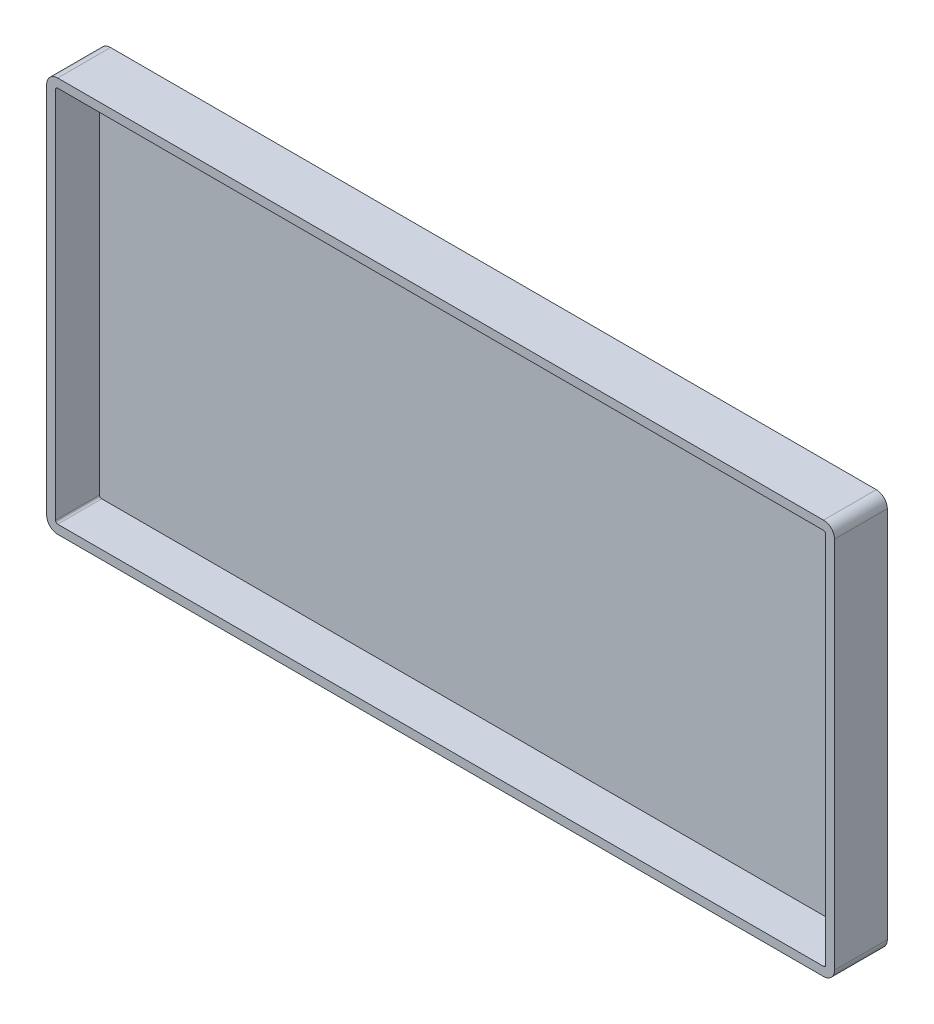
ISO-10303-21;
HEADER;
FILE_DESCRIPTION(('STEP AP214'),'2;1');
FILE_NAME('part.step','',(''),(''),'','','');
FILE_SCHEMA(('AUTOMOTIVE_DESIGN { 1 0 10303 214 1 1 1 1 }'));
ENDSEC;
DATA;
#1=APPLICATION_CONTEXT('core data for automotive mechanical design processes');
#2=APPLICATION_PROTOCOL_DEFINITION('international standard','automotive_design',2000,#1);
#3=PRODUCT_CONTEXT('',#1,'mechanical');
#4=PRODUCT('Part','Part','',(#3));
#5=PRODUCT_RELATED_PRODUCT_CATEGORY('part','',(#4));
#6=PRODUCT_DEFINITION_FORMATION('','',#4);
#7=PRODUCT_DEFINITION_CONTEXT('part definition',#1,'design');
#8=PRODUCT_DEFINITION('design','',#6,#7);
#9=PRODUCT_DEFINITION_SHAPE('','',#8);
#10=(LENGTH_UNIT() NAMED_UNIT(*) SI_UNIT(.MILLI.,.METRE.));
#11=(NAMED_UNIT(*) PLANE_ANGLE_UNIT() SI_UNIT($,.RADIAN.));
#12=(NAMED_UNIT(*) SI_UNIT($,.STERADIAN.) SOLID_ANGLE_UNIT());
#13=UNCERTAINTY_MEASURE_WITH_UNIT(LENGTH_MEASURE(1.E-05),#10,'distance_accuracy_value','');
#14=(GEOMETRIC_REPRESENTATION_CONTEXT(3) GLOBAL_UNCERTAINTY_ASSIGNED_CONTEXT((#13)) GLOBAL_UNIT_ASSIGNED_CONTEXT((#10,
#11,#12)) REPRESENTATION_CONTEXT('',''));
#15=CARTESIAN_POINT('',(0.,0.,0.));
#16=DIRECTION('',(0.,0.,1.));
#17=DIRECTION('',(1.,0.,0.));
#18=AXIS2_PLACEMENT_3D('',#15,#16,#17);
#19=CARTESIAN_POINT('',(87.5,42.4,10.));
#20=DIRECTION('',(0.,0.,-1.));
#21=DIRECTION('',(0.,-1.,0.));
#22=AXIS2_PLACEMENT_3D('',#19,#20,#21);
#23=PLANE('',#22);
#24=DIRECTION('',(0.,-1.,0.));
#25=VECTOR('',#24,1.);
#26=CARTESIAN_POINT('',(87.5,42.4,10.));
#27=LINE('',#26,#25);
#28=CARTESIAN_POINT('',(87.5,42.4,10.));
#29=VERTEX_POINT('',#28);
#30=CARTESIAN_POINT('',(87.5,-42.4,10.));
#31=VERTEX_POINT('',#30);
#32=EDGE_CURVE('E212',#29,#31,#27,.T.);
#33=ORIENTED_EDGE('',*,*,#32,.T.);
#34=CARTESIAN_POINT('',(87.,-42.4,10.));
#35=DIRECTION('',(0.,0.,1.));
#36=DIRECTION('',(1.,0.,0.));
#37=AXIS2_PLACEMENT_3D('',#34,#35,#36);
#38=CIRCLE('',#37,0.500000000000014);
#39=CARTESIAN_POINT('',(87.,-42.9,10.));
#40=VERTEX_POINT('',#39);
#41=EDGE_CURVE('E217',#40,#31,#38,.T.);
#42=ORIENTED_EDGE('',*,*,#41,.F.);
#43=DIRECTION('',(1.,0.,0.));
#44=VECTOR('',#43,1.);
#45=CARTESIAN_POINT('',(-87.,-42.9,10.));
#46=LINE('',#45,#44);
#47=CARTESIAN_POINT('',(-87.,-42.9,10.));
#48=VERTEX_POINT('',#47);
#49=EDGE_CURVE('E227',#48,#40,#46,.T.);
#50=ORIENTED_EDGE('',*,*,#49,.F.);
#51=CARTESIAN_POINT('',(-87.,-42.4,10.));
#52=DIRECTION('',(0.,0.,1.));
#53=DIRECTION('',(1.,0.,0.));
#54=AXIS2_PLACEMENT_3D('',#51,#52,#53);
#55=CIRCLE('',#54,0.500000000000007);
#56=CARTESIAN_POINT('',(-87.5,-42.4,10.));
#57=VERTEX_POINT('',#56);
#58=EDGE_CURVE('E232',#57,#48,#55,.T.);
#59=ORIENTED_EDGE('',*,*,#58,.F.);
#60=DIRECTION('',(0.,-1.,0.));
#61=VECTOR('',#60,1.);
#62=CARTESIAN_POINT('',(-87.5,42.4,10.));
#63=LINE('',#62,#61);
#64=CARTESIAN_POINT('',(-87.5,42.4,10.));
#65=VERTEX_POINT('',#64);
#66=EDGE_CURVE('E237',#65,#57,#63,.T.);
#67=ORIENTED_EDGE('',*,*,#66,.F.);
#68=CARTESIAN_POINT('',(-87.,42.4,10.));
#69=DIRECTION('',(0.,0.,1.));
#70=DIRECTION('',(1.,0.,0.));
#71=AXIS2_PLACEMENT_3D('',#68,#69,#70);
#72=CIRCLE('',#71,0.5);
#73=CARTESIAN_POINT('',(-87.,42.9,10.));
#74=VERTEX_POINT('',#73);
#75=EDGE_CURVE('E46',#74,#65,#72,.T.);
#76=ORIENTED_EDGE('',*,*,#75,.F.);
#77=DIRECTION('',(1.,0.,0.));
#78=VECTOR('',#77,1.);
#79=CARTESIAN_POINT('',(-87.,42.9,10.));
#80=LINE('',#79,#78);
#81=CARTESIAN_POINT('',(87.,42.9,10.));
#82=VERTEX_POINT('',#81);
#83=EDGE_CURVE('E193',#74,#82,#80,.T.);
#84=ORIENTED_EDGE('',*,*,#83,.T.);
#85=CARTESIAN_POINT('',(87.,42.4,10.));
#86=DIRECTION('',(0.,0.,-1.));
#87=DIRECTION('',(-1.,0.,0.));
#88=AXIS2_PLACEMENT_3D('',#85,#86,#87);
#89=CIRCLE('',#88,0.5);
#90=EDGE_CURVE('E208',#82,#29,#89,.T.);
#91=ORIENTED_EDGE('',*,*,#90,.T.);
#92=EDGE_LOOP('',(#33,#42,#50,#59,#67,#76,#84,#91));
#93=FACE_BOUND('',#92,.T.);
#94=DIRECTION('',(0.,-1.,0.));
#95=VECTOR('',#94,1.);
#96=CARTESIAN_POINT('',(89.5,42.4,10.));
#97=LINE('',#96,#95);
#98=CARTESIAN_POINT('',(89.5,42.4,10.));
#99=VERTEX_POINT('',#98);
#100=CARTESIAN_POINT('',(89.5,-42.4,10.));
#101=VERTEX_POINT('',#100);
#102=EDGE_CURVE('E40',#99,#101,#97,.T.);
#103=ORIENTED_EDGE('',*,*,#102,.F.);
#104=CARTESIAN_POINT('',(87.,42.4,10.));
#105=DIRECTION('',(0.,0.,1.));
#106=DIRECTION('',(1.,0.,0.));
#107=AXIS2_PLACEMENT_3D('',#104,#105,#106);
#108=CIRCLE('',#107,2.5);
#109=CARTESIAN_POINT('',(87.,44.9,10.));
#110=VERTEX_POINT('',#109);
#111=EDGE_CURVE('E180',#110,#99,#108,.F.);
#112=ORIENTED_EDGE('',*,*,#111,.F.);
#113=DIRECTION('',(1.,0.,0.));
#114=VECTOR('',#113,1.);
#115=CARTESIAN_POINT('',(-87.,44.9,10.));
#116=LINE('',#115,#114);
#117=CARTESIAN_POINT('',(-87.,44.9,10.));
#118=VERTEX_POINT('',#117);
#119=EDGE_CURVE('E177',#118,#110,#116,.T.);
#120=ORIENTED_EDGE('',*,*,#119,.F.);
#121=CARTESIAN_POINT('',(-87.,42.4,10.));
#122=DIRECTION('',(0.,0.,1.));
#123=DIRECTION('',(1.,0.,0.));
#124=AXIS2_PLACEMENT_3D('',#121,#122,#123);
#125=CIRCLE('',#124,2.5);
#126=CARTESIAN_POINT('',(-89.5,42.4,10.));
#127=VERTEX_POINT('',#126);
#128=EDGE_CURVE('E172',#118,#127,#125,.T.);
#129=ORIENTED_EDGE('',*,*,#128,.T.);
#130=DIRECTION('',(0.,1.,0.));
#131=VECTOR('',#130,1.);
#132=CARTESIAN_POINT('',(-89.5,42.4,10.));
#133=LINE('',#132,#131);
#134=CARTESIAN_POINT('',(-89.5,-42.4,10.));
#135=VERTEX_POINT('',#134);
#136=EDGE_CURVE('E167',#127,#135,#133,.F.);
#137=ORIENTED_EDGE('',*,*,#136,.T.);
#138=CARTESIAN_POINT('',(-87.,-42.4,10.));
#139=DIRECTION('',(0.,0.,1.));
#140=DIRECTION('',(1.,0.,0.));
#141=AXIS2_PLACEMENT_3D('',#138,#139,#140);
#142=CIRCLE('',#141,2.50000000000001);
#143=CARTESIAN_POINT('',(-87.,-44.9,10.));
#144=VERTEX_POINT('',#143);
#145=EDGE_CURVE('E163',#135,#144,#142,.T.);
#146=ORIENTED_EDGE('',*,*,#145,.T.);
#147=DIRECTION('',(1.,0.,0.));
#148=VECTOR('',#147,1.);
#149=CARTESIAN_POINT('',(-87.,-44.9,10.));
#150=LINE('',#149,#148);
#151=CARTESIAN_POINT('',(87.,-44.9,10.));
#152=VERTEX_POINT('',#151);
#153=EDGE_CURVE('E154',#144,#152,#150,.T.);
#154=ORIENTED_EDGE('',*,*,#153,.T.);
#155=CARTESIAN_POINT('',(87.,-42.4,10.));
#156=DIRECTION('',(0.,0.,1.));
#157=DIRECTION('',(1.,0.,0.));
#158=AXIS2_PLACEMENT_3D('',#155,#156,#157);
#159=CIRCLE('',#158,2.50000000000001);
#160=EDGE_CURVE('E142',#152,#101,#159,.T.);
#161=ORIENTED_EDGE('',*,*,#160,.T.);
#162=EDGE_LOOP('',(#103,#112,#120,#129,#137,#146,#154,#161));
#163=FACE_BOUND('',#162,.T.);
#164=ADVANCED_FACE('F37',(#93,#163),#23,.F.);
#165=CARTESIAN_POINT('',(87.,-42.4,0.));
#166=DIRECTION('',(0.,0.,1.));
#167=DIRECTION('',(1.,0.,0.));
#168=AXIS2_PLACEMENT_3D('',#165,#166,#167);
#169=CYLINDRICAL_SURFACE('',#168,0.500000000000014);
#170=ORIENTED_EDGE('',*,*,#41,.T.);
#171=DIRECTION('',(0.,0.,1.));
#172=VECTOR('',#171,1.);
#173=CARTESIAN_POINT('',(87.5,-42.4,0.));
#174=LINE('',#173,#172);
#175=CARTESIAN_POINT('',(87.5,-42.4,0.));
#176=VERTEX_POINT('',#175);
#177=EDGE_CURVE('E214',#176,#31,#174,.T.);
#178=ORIENTED_EDGE('',*,*,#177,.F.);
#179=CARTESIAN_POINT('',(87.,-42.4,0.));
#180=DIRECTION('',(0.,0.,1.));
#181=DIRECTION('',(1.,0.,0.));
#182=AXIS2_PLACEMENT_3D('',#179,#180,#181);
#183=CIRCLE('',#182,0.500000000000014);
#184=CARTESIAN_POINT('',(87.,-42.9,0.));
#185=VERTEX_POINT('',#184);
#186=EDGE_CURVE('E222',#185,#176,#183,.T.);
#187=ORIENTED_EDGE('',*,*,#186,.F.);
#188=DIRECTION('',(0.,0.,1.));
#189=VECTOR('',#188,1.);
#190=CARTESIAN_POINT('',(87.,-42.9,0.));
#191=LINE('',#190,#189);
#192=EDGE_CURVE('E219',#185,#40,#191,.T.);
#193=ORIENTED_EDGE('',*,*,#192,.T.);
#194=EDGE_LOOP('',(#170,#178,#187,#193));
#195=FACE_BOUND('',#194,.T.);
#196=ADVANCED_FACE('F294',(#195),#169,.F.);
#197=CARTESIAN_POINT('',(-87.,-42.9,0.));
#198=DIRECTION('',(0.,-1.,0.));
#199=DIRECTION('',(0.,0.,-1.));
#200=AXIS2_PLACEMENT_3D('',#197,#198,#199);
#201=PLANE('',#200);
#202=ORIENTED_EDGE('',*,*,#49,.T.);
#203=ORIENTED_EDGE('',*,*,#192,.F.);
#204=DIRECTION('',(1.,0.,0.));
#205=VECTOR('',#204,1.);
#206=CARTESIAN_POINT('',(-87.,-42.9,0.));
#207=LINE('',#206,#205);
#208=CARTESIAN_POINT('',(-87.,-42.9,0.));
#209=VERTEX_POINT('',#208);
#210=EDGE_CURVE('E226',#209,#185,#207,.T.);
#211=ORIENTED_EDGE('',*,*,#210,.F.);
#212=DIRECTION('',(0.,0.,1.));
#213=VECTOR('',#212,1.);
#214=CARTESIAN_POINT('',(-87.,-42.9,0.));
#215=LINE('',#214,#213);
#216=EDGE_CURVE('E223',#209,#48,#215,.T.);
#217=ORIENTED_EDGE('',*,*,#216,.T.);
#218=EDGE_LOOP('',(#202,#203,#211,#217));
#219=FACE_BOUND('',#218,.T.);
#220=ADVANCED_FACE('F286',(#219),#201,.F.);
#221=CARTESIAN_POINT('',(-87.,-42.4,0.));
#222=DIRECTION('',(0.,0.,1.));
#223=DIRECTION('',(1.,0.,0.));
#224=AXIS2_PLACEMENT_3D('',#221,#222,#223);
#225=CYLINDRICAL_SURFACE('',#224,0.500000000000007);
#226=ORIENTED_EDGE('',*,*,#58,.T.);
#227=ORIENTED_EDGE('',*,*,#216,.F.);
#228=CARTESIAN_POINT('',(-87.,-42.4,0.));
#229=DIRECTION('',(0.,0.,1.));
#230=DIRECTION('',(1.,0.,0.));
#231=AXIS2_PLACEMENT_3D('',#228,#229,#230);
#232=CIRCLE('',#231,0.500000000000007);
#233=CARTESIAN_POINT('',(-87.5,-42.4,0.));
#234=VERTEX_POINT('',#233);
#235=EDGE_CURVE('E231',#234,#209,#232,.T.);
#236=ORIENTED_EDGE('',*,*,#235,.F.);
#237=DIRECTION('',(0.,0.,1.));
#238=VECTOR('',#237,1.);
#239=CARTESIAN_POINT('',(-87.5,-42.4,0.));
#240=LINE('',#239,#238);
#241=EDGE_CURVE('E228',#234,#57,#240,.T.);
#242=ORIENTED_EDGE('',*,*,#241,.T.);
#243=EDGE_LOOP('',(#226,#227,#236,#242));
#244=FACE_BOUND('',#243,.T.);
#245=ADVANCED_FACE('F287',(#244),#225,.F.);
#246=CARTESIAN_POINT('',(-87.5,42.4,0.));
#247=DIRECTION('',(-1.,0.,0.));
#248=DIRECTION('',(0.,0.,1.));
#249=AXIS2_PLACEMENT_3D('',#246,#247,#248);
#250=PLANE('',#249);
#251=ORIENTED_EDGE('',*,*,#66,.T.);
#252=ORIENTED_EDGE('',*,*,#241,.F.);
#253=DIRECTION('',(0.,-1.,0.));
#254=VECTOR('',#253,1.);
#255=CARTESIAN_POINT('',(-87.5,42.4,0.));
#256=LINE('',#255,#254);
#257=CARTESIAN_POINT('',(-87.5,42.4,0.));
#258=VERTEX_POINT('',#257);
#259=EDGE_CURVE('E236',#258,#234,#256,.T.);
#260=ORIENTED_EDGE('',*,*,#259,.F.);
#261=DIRECTION('',(0.,0.,1.));
#262=VECTOR('',#261,1.);
#263=CARTESIAN_POINT('',(-87.5,42.4,0.));
#264=LINE('',#263,#262);
#265=EDGE_CURVE('E233',#258,#65,#264,.T.);
#266=ORIENTED_EDGE('',*,*,#265,.T.);
#267=EDGE_LOOP('',(#251,#252,#260,#266));
#268=FACE_BOUND('',#267,.T.);
#269=ADVANCED_FACE('F305',(#268),#250,.F.);
#270=CARTESIAN_POINT('',(-87.,42.4,0.));
#271=DIRECTION('',(0.,0.,1.));
#272=DIRECTION('',(1.,0.,0.));
#273=AXIS2_PLACEMENT_3D('',#270,#271,#272);
#274=CYLINDRICAL_SURFACE('',#273,0.5);
#275=ORIENTED_EDGE('',*,*,#75,.T.);
#276=ORIENTED_EDGE('',*,*,#265,.F.);
#277=CARTESIAN_POINT('',(-87.,42.4,0.));
#278=DIRECTION('',(0.,0.,1.));
#279=DIRECTION('',(1.,0.,0.));
#280=AXIS2_PLACEMENT_3D('',#277,#278,#279);
#281=CIRCLE('',#280,0.5);
#282=CARTESIAN_POINT('',(-87.,42.9,0.));
#283=VERTEX_POINT('',#282);
#284=EDGE_CURVE('E11',#283,#258,#281,.T.);
#285=ORIENTED_EDGE('',*,*,#284,.F.);
#286=DIRECTION('',(0.,0.,1.));
#287=VECTOR('',#286,1.);
#288=CARTESIAN_POINT('',(-87.,42.9,0.));
#289=LINE('',#288,#287);
#290=EDGE_CURVE('E201',#283,#74,#289,.T.);
#291=ORIENTED_EDGE('',*,*,#290,.T.);
#292=EDGE_LOOP('',(#275,#276,#285,#291));
#293=FACE_BOUND('',#292,.T.);
#294=ADVANCED_FACE('F303',(#293),#274,.F.);
#295=CARTESIAN_POINT('',(87.5,42.4,0.));
#296=DIRECTION('',(-1.,0.,0.));
#297=DIRECTION('',(0.,-1.,0.));
#298=AXIS2_PLACEMENT_3D('',#295,#296,#297);
#299=PLANE('',#298);
#300=ORIENTED_EDGE('',*,*,#32,.F.);
#301=DIRECTION('',(0.,0.,1.));
#302=VECTOR('',#301,1.);
#303=CARTESIAN_POINT('',(87.5,42.4,0.));
#304=LINE('',#303,#302);
#305=CARTESIAN_POINT('',(87.5,42.4,0.));
#306=VERTEX_POINT('',#305);
#307=EDGE_CURVE('E209',#306,#29,#304,.T.);
#308=ORIENTED_EDGE('',*,*,#307,.F.);
#309=DIRECTION('',(0.,-1.,0.));
#310=VECTOR('',#309,1.);
#311=CARTESIAN_POINT('',(87.5,42.4,0.));
#312=LINE('',#311,#310);
#313=EDGE_CURVE('E218',#306,#176,#312,.T.);
#314=ORIENTED_EDGE('',*,*,#313,.T.);
#315=ORIENTED_EDGE('',*,*,#177,.T.);
#316=EDGE_LOOP('',(#300,#308,#314,#315));
#317=FACE_BOUND('',#316,.T.);
#318=ADVANCED_FACE('F297',(#317),#299,.T.);
#319=CARTESIAN_POINT('',(87.,42.4,0.));
#320=DIRECTION('',(0.,0.,1.));
#321=DIRECTION('',(1.,0.,0.));
#322=AXIS2_PLACEMENT_3D('',#319,#320,#321);
#323=CYLINDRICAL_SURFACE('',#322,0.5);
#324=ORIENTED_EDGE('',*,*,#90,.F.);
#325=DIRECTION('',(0.,0.,1.));
#326=VECTOR('',#325,1.);
#327=CARTESIAN_POINT('',(87.,42.9,0.));
#328=LINE('',#327,#326);
#329=CARTESIAN_POINT('',(87.,42.9,0.));
#330=VERTEX_POINT('',#329);
#331=EDGE_CURVE('E205',#330,#82,#328,.T.);
#332=ORIENTED_EDGE('',*,*,#331,.F.);
#333=CARTESIAN_POINT('',(87.,42.4,0.));
#334=DIRECTION('',(0.,0.,-1.));
#335=DIRECTION('',(-1.,0.,0.));
#336=AXIS2_PLACEMENT_3D('',#333,#334,#335);
#337=CIRCLE('',#336,0.5);
#338=EDGE_CURVE('E213',#330,#306,#337,.T.);
#339=ORIENTED_EDGE('',*,*,#338,.T.);
#340=ORIENTED_EDGE('',*,*,#307,.T.);
#341=EDGE_LOOP('',(#324,#332,#339,#340));
#342=FACE_BOUND('',#341,.T.);
#343=ADVANCED_FACE('F299',(#342),#323,.F.);
#344=CARTESIAN_POINT('',(-87.,42.9,0.));
#345=DIRECTION('',(0.,-1.,0.));
#346=DIRECTION('',(0.,0.,-1.));
#347=AXIS2_PLACEMENT_3D('',#344,#345,#346);
#348=PLANE('',#347);
#349=ORIENTED_EDGE('',*,*,#83,.F.);
#350=ORIENTED_EDGE('',*,*,#290,.F.);
#351=DIRECTION('',(1.,0.,0.));
#352=VECTOR('',#351,1.);
#353=CARTESIAN_POINT('',(-87.,42.9,0.));
#354=LINE('',#353,#352);
#355=EDGE_CURVE('E204',#283,#330,#354,.T.);
#356=ORIENTED_EDGE('',*,*,#355,.T.);
#357=ORIENTED_EDGE('',*,*,#331,.T.);
#358=EDGE_LOOP('',(#349,#350,#356,#357));
#359=FACE_BOUND('',#358,.T.);
#360=ADVANCED_FACE('F265',(#359),#348,.T.);
#361=CARTESIAN_POINT('',(87.,-42.4,0.));
#362=DIRECTION('',(0.,0.,1.));
#363=DIRECTION('',(1.,0.,0.));
#364=AXIS2_PLACEMENT_3D('',#361,#362,#363);
#365=PLANE('',#364);
#366=ORIENTED_EDGE('',*,*,#186,.T.);
#367=ORIENTED_EDGE('',*,*,#313,.F.);
#368=ORIENTED_EDGE('',*,*,#338,.F.);
#369=ORIENTED_EDGE('',*,*,#355,.F.);
#370=ORIENTED_EDGE('',*,*,#284,.T.);
#371=ORIENTED_EDGE('',*,*,#259,.T.);
#372=ORIENTED_EDGE('',*,*,#235,.T.);
#373=ORIENTED_EDGE('',*,*,#210,.T.);
#374=EDGE_LOOP('',(#366,#367,#368,#369,#370,#371,#372,#373));
#375=FACE_BOUND('',#374,.T.);
#376=ADVANCED_FACE('F270',(#375),#365,.T.);
#377=CARTESIAN_POINT('',(87.,-42.4,0.));
#378=DIRECTION('',(0.,0.,1.));
#379=DIRECTION('',(1.,0.,0.));
#380=AXIS2_PLACEMENT_3D('',#377,#378,#379);
#381=CYLINDRICAL_SURFACE('',#380,2.50000000000001);
#382=ORIENTED_EDGE('',*,*,#160,.F.);
#383=DIRECTION('',(0.,0.,1.));
#384=VECTOR('',#383,1.);
#385=CARTESIAN_POINT('',(87.,-44.9,0.));
#386=LINE('',#385,#384);
#387=CARTESIAN_POINT('',(87.,-44.9,-2.));
#388=VERTEX_POINT('',#387);
#389=EDGE_CURVE('E155',#388,#152,#386,.T.);
#390=ORIENTED_EDGE('',*,*,#389,.F.);
#391=CARTESIAN_POINT('',(87.,-42.4,-2.));
#392=DIRECTION('',(0.,0.,1.));
#393=DIRECTION('',(1.,0.,0.));
#394=AXIS2_PLACEMENT_3D('',#391,#392,#393);
#395=CIRCLE('',#394,2.50000000000001);
#396=CARTESIAN_POINT('',(89.5,-42.4,-2.));
#397=VERTEX_POINT('',#396);
#398=EDGE_CURVE('E145',#388,#397,#395,.T.);
#399=ORIENTED_EDGE('',*,*,#398,.T.);
#400=DIRECTION('',(0.,0.,1.));
#401=VECTOR('',#400,1.);
#402=CARTESIAN_POINT('',(89.5,-42.4,0.));
#403=LINE('',#402,#401);
#404=EDGE_CURVE('E138',#397,#101,#403,.T.);
#405=ORIENTED_EDGE('',*,*,#404,.T.);
#406=EDGE_LOOP('',(#382,#390,#399,#405));
#407=FACE_BOUND('',#406,.T.);
#408=ADVANCED_FACE('F139',(#407),#381,.T.);
#409=CARTESIAN_POINT('',(-87.,-44.9,0.));
#410=DIRECTION('',(0.,-1.,0.));
#411=DIRECTION('',(0.,0.,-1.));
#412=AXIS2_PLACEMENT_3D('',#409,#410,#411);
#413=PLANE('',#412);
#414=ORIENTED_EDGE('',*,*,#153,.F.);
#415=DIRECTION('',(0.,0.,-1.));
#416=VECTOR('',#415,1.);
#417=CARTESIAN_POINT('',(-87.,-44.9,0.));
#418=LINE('',#417,#416);
#419=CARTESIAN_POINT('',(-87.,-44.9,-2.));
#420=VERTEX_POINT('',#419);
#421=EDGE_CURVE('E162',#420,#144,#418,.F.);
#422=ORIENTED_EDGE('',*,*,#421,.F.);
#423=DIRECTION('',(1.,0.,0.));
#424=VECTOR('',#423,1.);
#425=CARTESIAN_POINT('',(87.,-44.9,-2.));
#426=LINE('',#425,#424);
#427=EDGE_CURVE('E166',#420,#388,#426,.T.);
#428=ORIENTED_EDGE('',*,*,#427,.T.);
#429=ORIENTED_EDGE('',*,*,#389,.T.);
#430=EDGE_LOOP('',(#414,#422,#428,#429));
#431=FACE_BOUND('',#430,.T.);
#432=ADVANCED_FACE('F336',(#431),#413,.T.);
#433=CARTESIAN_POINT('',(-87.,-42.4,0.));
#434=DIRECTION('',(0.,0.,1.));
#435=DIRECTION('',(1.,0.,0.));
#436=AXIS2_PLACEMENT_3D('',#433,#434,#435);
#437=CYLINDRICAL_SURFACE('',#436,2.50000000000001);
#438=ORIENTED_EDGE('',*,*,#145,.F.);
#439=DIRECTION('',(0.,0.,1.));
#440=VECTOR('',#439,1.);
#441=CARTESIAN_POINT('',(-89.5,-42.4,0.));
#442=LINE('',#441,#440);
#443=CARTESIAN_POINT('',(-89.5,-42.4,-2.));
#444=VERTEX_POINT('',#443);
#445=EDGE_CURVE('E165',#444,#135,#442,.T.);
#446=ORIENTED_EDGE('',*,*,#445,.F.);
#447=CARTESIAN_POINT('',(-87.,-42.4,-2.));
#448=DIRECTION('',(0.,0.,1.));
#449=DIRECTION('',(1.,0.,0.));
#450=AXIS2_PLACEMENT_3D('',#447,#448,#449);
#451=CIRCLE('',#450,2.50000000000001);
#452=EDGE_CURVE('E171',#444,#420,#451,.T.);
#453=ORIENTED_EDGE('',*,*,#452,.T.);
#454=ORIENTED_EDGE('',*,*,#421,.T.);
#455=EDGE_LOOP('',(#438,#446,#453,#454));
#456=FACE_BOUND('',#455,.T.);
#457=ADVANCED_FACE('F341',(#456),#437,.T.);
#458=CARTESIAN_POINT('',(-89.5,42.4,0.));
#459=DIRECTION('',(-1.,0.,0.));
#460=DIRECTION('',(0.,0.,1.));
#461=AXIS2_PLACEMENT_3D('',#458,#459,#460);
#462=PLANE('',#461);
#463=ORIENTED_EDGE('',*,*,#136,.F.);
#464=DIRECTION('',(0.,0.,1.));
#465=VECTOR('',#464,1.);
#466=CARTESIAN_POINT('',(-89.5,42.4,0.));
#467=LINE('',#466,#465);
#468=CARTESIAN_POINT('',(-89.5,42.4,-2.));
#469=VERTEX_POINT('',#468);
#470=EDGE_CURVE('E170',#469,#127,#467,.T.);
#471=ORIENTED_EDGE('',*,*,#470,.F.);
#472=DIRECTION('',(0.,-1.,0.));
#473=VECTOR('',#472,1.);
#474=CARTESIAN_POINT('',(-89.5,-42.4,-2.));
#475=LINE('',#474,#473);
#476=EDGE_CURVE('E176',#469,#444,#475,.T.);
#477=ORIENTED_EDGE('',*,*,#476,.T.);
#478=ORIENTED_EDGE('',*,*,#445,.T.);
#479=EDGE_LOOP('',(#463,#471,#477,#478));
#480=FACE_BOUND('',#479,.T.);
#481=ADVANCED_FACE('F345',(#480),#462,.T.);
#482=CARTESIAN_POINT('',(-87.,42.4,0.));
#483=DIRECTION('',(0.,0.,1.));
#484=DIRECTION('',(1.,0.,0.));
#485=AXIS2_PLACEMENT_3D('',#482,#483,#484);
#486=CYLINDRICAL_SURFACE('',#485,2.5);
#487=ORIENTED_EDGE('',*,*,#128,.F.);
#488=DIRECTION('',(0.,0.,1.));
#489=VECTOR('',#488,1.);
#490=CARTESIAN_POINT('',(-87.,44.9,0.));
#491=LINE('',#490,#489);
#492=CARTESIAN_POINT('',(-87.,44.9,-2.));
#493=VERTEX_POINT('',#492);
#494=EDGE_CURVE('E179',#493,#118,#491,.T.);
#495=ORIENTED_EDGE('',*,*,#494,.F.);
#496=CARTESIAN_POINT('',(-87.,42.4,-2.));
#497=DIRECTION('',(0.,0.,1.));
#498=DIRECTION('',(1.,0.,0.));
#499=AXIS2_PLACEMENT_3D('',#496,#497,#498);
#500=CIRCLE('',#499,2.5);
#501=EDGE_CURVE('E175',#493,#469,#500,.T.);
#502=ORIENTED_EDGE('',*,*,#501,.T.);
#503=ORIENTED_EDGE('',*,*,#470,.T.);
#504=EDGE_LOOP('',(#487,#495,#502,#503));
#505=FACE_BOUND('',#504,.T.);
#506=ADVANCED_FACE('F349',(#505),#486,.T.);
#507=CARTESIAN_POINT('',(89.5,42.4,0.));
#508=DIRECTION('',(-1.,0.,0.));
#509=DIRECTION('',(0.,-1.,0.));
#510=AXIS2_PLACEMENT_3D('',#507,#508,#509);
#511=PLANE('',#510);
#512=ORIENTED_EDGE('',*,*,#102,.T.);
#513=ORIENTED_EDGE('',*,*,#404,.F.);
#514=DIRECTION('',(0.,-1.,0.));
#515=VECTOR('',#514,1.);
#516=CARTESIAN_POINT('',(89.5,-42.4,-2.));
#517=LINE('',#516,#515);
#518=CARTESIAN_POINT('',(89.5,42.4,-2.));
#519=VERTEX_POINT('',#518);
#520=EDGE_CURVE('E146',#519,#397,#517,.T.);
#521=ORIENTED_EDGE('',*,*,#520,.F.);
#522=DIRECTION('',(0.,0.,1.));
#523=VECTOR('',#522,1.);
#524=CARTESIAN_POINT('',(89.5,42.4,0.));
#525=LINE('',#524,#523);
#526=EDGE_CURVE('E131',#519,#99,#525,.T.);
#527=ORIENTED_EDGE('',*,*,#526,.T.);
#528=EDGE_LOOP('',(#512,#513,#521,#527));
#529=FACE_BOUND('',#528,.T.);
#530=ADVANCED_FACE('F149',(#529),#511,.F.);
#531=CARTESIAN_POINT('',(87.,42.4,0.));
#532=DIRECTION('',(0.,0.,1.));
#533=DIRECTION('',(1.,0.,0.));
#534=AXIS2_PLACEMENT_3D('',#531,#532,#533);
#535=CYLINDRICAL_SURFACE('',#534,2.5);
#536=ORIENTED_EDGE('',*,*,#111,.T.);
#537=ORIENTED_EDGE('',*,*,#526,.F.);
#538=CARTESIAN_POINT('',(87.,42.4,-2.));
#539=DIRECTION('',(0.,0.,1.));
#540=DIRECTION('',(1.,0.,0.));
#541=AXIS2_PLACEMENT_3D('',#538,#539,#540);
#542=CIRCLE('',#541,2.5);
#543=CARTESIAN_POINT('',(87.,44.9,-2.));
#544=VERTEX_POINT('',#543);
#545=EDGE_CURVE('E181',#544,#519,#542,.F.);
#546=ORIENTED_EDGE('',*,*,#545,.F.);
#547=DIRECTION('',(0.,0.,-1.));
#548=VECTOR('',#547,1.);
#549=CARTESIAN_POINT('',(87.,44.9,0.));
#550=LINE('',#549,#548);
#551=EDGE_CURVE('E182',#544,#110,#550,.F.);
#552=ORIENTED_EDGE('',*,*,#551,.T.);
#553=EDGE_LOOP('',(#536,#537,#546,#552));
#554=FACE_BOUND('',#553,.T.);
#555=ADVANCED_FACE('F356',(#554),#535,.T.);
#556=CARTESIAN_POINT('',(-87.,44.9,0.));
#557=DIRECTION('',(0.,-1.,0.));
#558=DIRECTION('',(0.,0.,-1.));
#559=AXIS2_PLACEMENT_3D('',#556,#557,#558);
#560=PLANE('',#559);
#561=ORIENTED_EDGE('',*,*,#119,.T.);
#562=ORIENTED_EDGE('',*,*,#551,.F.);
#563=DIRECTION('',(1.,0.,0.));
#564=VECTOR('',#563,1.);
#565=CARTESIAN_POINT('',(87.,44.9,-2.));
#566=LINE('',#565,#564);
#567=EDGE_CURVE('E185',#493,#544,#566,.T.);
#568=ORIENTED_EDGE('',*,*,#567,.F.);
#569=ORIENTED_EDGE('',*,*,#494,.T.);
#570=EDGE_LOOP('',(#561,#562,#568,#569));
#571=FACE_BOUND('',#570,.T.);
#572=ADVANCED_FACE('F359',(#571),#560,.F.);
#573=CARTESIAN_POINT('',(87.,-42.4,-2.));
#574=DIRECTION('',(0.,0.,1.));
#575=DIRECTION('',(1.,0.,0.));
#576=AXIS2_PLACEMENT_3D('',#573,#574,#575);
#577=PLANE('',#576);
#578=ORIENTED_EDGE('',*,*,#398,.F.);
#579=ORIENTED_EDGE('',*,*,#427,.F.);
#580=ORIENTED_EDGE('',*,*,#452,.F.);
#581=ORIENTED_EDGE('',*,*,#476,.F.);
#582=ORIENTED_EDGE('',*,*,#501,.F.);
#583=ORIENTED_EDGE('',*,*,#567,.T.);
#584=ORIENTED_EDGE('',*,*,#545,.T.);
#585=ORIENTED_EDGE('',*,*,#520,.T.);
#586=EDGE_LOOP('',(#578,#579,#580,#581,#582,#583,#584,#585));
#587=FACE_BOUND('',#586,.T.);
#588=ADVANCED_FACE('F361',(#587),#577,.F.);
#589=CLOSED_SHELL('',(#164,#196,#220,#245,#269,#294,#318,#343,#360,#376,#408,#432,#457,#481,
#506,#530,#555,#572,#588));
#590=MANIFOLD_SOLID_BREP('B2',#589);
#591=ADVANCED_BREP_SHAPE_REPRESENTATION('',(#18,#590),#14);
#592=SHAPE_DEFINITION_REPRESENTATION(#9,#591);
ENDSEC;
END-ISO-10303-21;
